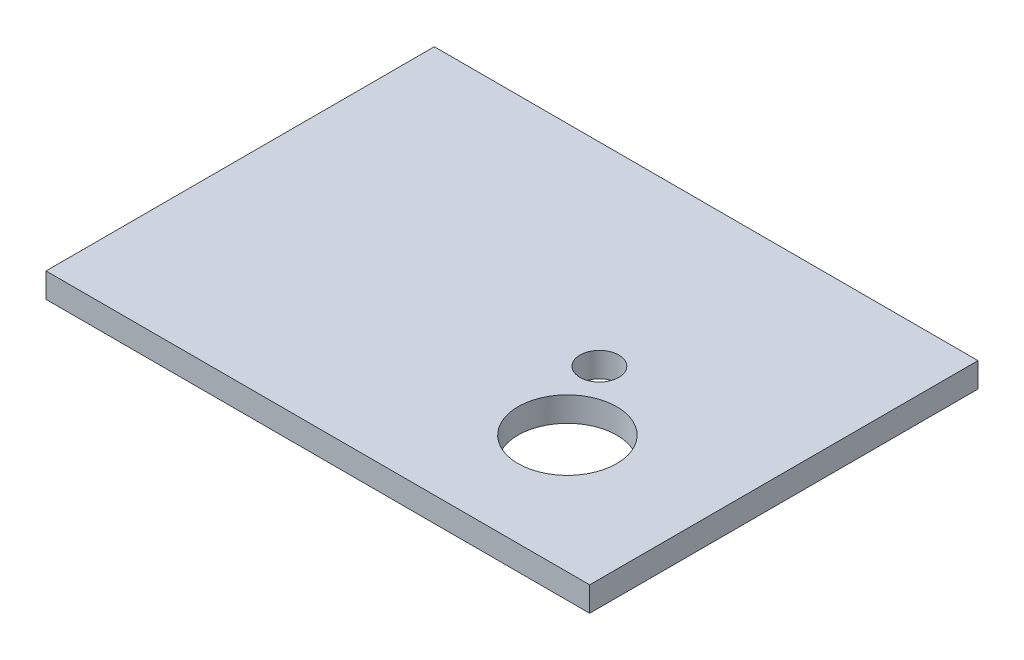
ISO-10303-21;
HEADER;
FILE_DESCRIPTION(('STEP AP214'),'2;1');
FILE_NAME('part.step','',(''),(''),'','','');
FILE_SCHEMA(('AUTOMOTIVE_DESIGN { 1 0 10303 214 1 1 1 1 }'));
ENDSEC;
DATA;
#1=APPLICATION_CONTEXT('core data for automotive mechanical design processes');
#2=APPLICATION_PROTOCOL_DEFINITION('international standard','automotive_design',2000,#1);
#3=PRODUCT_CONTEXT('',#1,'mechanical');
#4=PRODUCT('Part','Part','',(#3));
#5=PRODUCT_RELATED_PRODUCT_CATEGORY('part','',(#4));
#6=PRODUCT_DEFINITION_FORMATION('','',#4);
#7=PRODUCT_DEFINITION_CONTEXT('part definition',#1,'design');
#8=PRODUCT_DEFINITION('design','',#6,#7);
#9=PRODUCT_DEFINITION_SHAPE('','',#8);
#10=(LENGTH_UNIT() NAMED_UNIT(*) SI_UNIT(.MILLI.,.METRE.));
#11=(NAMED_UNIT(*) PLANE_ANGLE_UNIT() SI_UNIT($,.RADIAN.));
#12=(NAMED_UNIT(*) SI_UNIT($,.STERADIAN.) SOLID_ANGLE_UNIT());
#13=UNCERTAINTY_MEASURE_WITH_UNIT(LENGTH_MEASURE(1.E-05),#10,'distance_accuracy_value','');
#14=(GEOMETRIC_REPRESENTATION_CONTEXT(3) GLOBAL_UNCERTAINTY_ASSIGNED_CONTEXT((#13)) GLOBAL_UNIT_ASSIGNED_CONTEXT((#10,
#11,#12)) REPRESENTATION_CONTEXT('',''));
#15=CARTESIAN_POINT('',(0.,0.,0.));
#16=DIRECTION('',(0.,0.,1.));
#17=DIRECTION('',(1.,0.,0.));
#18=AXIS2_PLACEMENT_3D('',#15,#16,#17);
#19=CARTESIAN_POINT('',(0.,6.35,0.));
#20=DIRECTION('',(1.,0.,0.));
#21=DIRECTION('',(0.,0.,-1.));
#22=AXIS2_PLACEMENT_3D('',#19,#20,#21);
#23=PLANE('',#22);
#24=DIRECTION('',(0.,0.,1.));
#25=VECTOR('',#24,1.);
#26=CARTESIAN_POINT('',(0.,0.,0.));
#27=LINE('',#26,#25);
#28=CARTESIAN_POINT('',(0.,0.,-100.));
#29=VERTEX_POINT('',#28);
#30=CARTESIAN_POINT('',(0.,0.,0.));
#31=VERTEX_POINT('',#30);
#32=EDGE_CURVE('E99',#29,#31,#27,.T.);
#33=ORIENTED_EDGE('',*,*,#32,.T.);
#34=DIRECTION('',(0.,-1.,0.));
#35=VECTOR('',#34,1.);
#36=CARTESIAN_POINT('',(0.,6.35,0.));
#37=LINE('',#36,#35);
#38=CARTESIAN_POINT('',(0.,6.35,0.));
#39=VERTEX_POINT('',#38);
#40=EDGE_CURVE('E11',#39,#31,#37,.T.);
#41=ORIENTED_EDGE('',*,*,#40,.F.);
#42=DIRECTION('',(0.,0.,1.));
#43=VECTOR('',#42,1.);
#44=CARTESIAN_POINT('',(0.,6.35,0.));
#45=LINE('',#44,#43);
#46=CARTESIAN_POINT('',(0.,6.35,-100.));
#47=VERTEX_POINT('',#46);
#48=EDGE_CURVE('E86',#47,#39,#45,.T.);
#49=ORIENTED_EDGE('',*,*,#48,.F.);
#50=DIRECTION('',(0.,-1.,0.));
#51=VECTOR('',#50,1.);
#52=CARTESIAN_POINT('',(0.,6.35,-100.));
#53=LINE('',#52,#51);
#54=EDGE_CURVE('E95',#47,#29,#53,.T.);
#55=ORIENTED_EDGE('',*,*,#54,.T.);
#56=EDGE_LOOP('',(#33,#41,#49,#55));
#57=FACE_BOUND('',#56,.T.);
#58=ADVANCED_FACE('F33',(#57),#23,.F.);
#59=CARTESIAN_POINT('',(0.,6.35,0.));
#60=DIRECTION('',(0.,0.,-1.));
#61=DIRECTION('',(-1.,0.,0.));
#62=AXIS2_PLACEMENT_3D('',#59,#60,#61);
#63=PLANE('',#62);
#64=DIRECTION('',(1.,0.,0.));
#65=VECTOR('',#64,1.);
#66=CARTESIAN_POINT('',(0.,0.,0.));
#67=LINE('',#66,#65);
#68=CARTESIAN_POINT('',(140.,0.,0.));
#69=VERTEX_POINT('',#68);
#70=EDGE_CURVE('E90',#31,#69,#67,.T.);
#71=ORIENTED_EDGE('',*,*,#70,.T.);
#72=DIRECTION('',(0.,-1.,0.));
#73=VECTOR('',#72,1.);
#74=CARTESIAN_POINT('',(140.,6.35,0.));
#75=LINE('',#74,#73);
#76=CARTESIAN_POINT('',(140.,6.35,0.));
#77=VERTEX_POINT('',#76);
#78=EDGE_CURVE('E42',#77,#69,#75,.T.);
#79=ORIENTED_EDGE('',*,*,#78,.F.);
#80=DIRECTION('',(1.,0.,0.));
#81=VECTOR('',#80,1.);
#82=CARTESIAN_POINT('',(0.,6.35,0.));
#83=LINE('',#82,#81);
#84=EDGE_CURVE('E81',#39,#77,#83,.T.);
#85=ORIENTED_EDGE('',*,*,#84,.F.);
#86=ORIENTED_EDGE('',*,*,#40,.T.);
#87=EDGE_LOOP('',(#71,#79,#85,#86));
#88=FACE_BOUND('',#87,.T.);
#89=ADVANCED_FACE('F89',(#88),#63,.F.);
#90=CARTESIAN_POINT('',(140.,6.35,0.));
#91=DIRECTION('',(-1.,0.,0.));
#92=DIRECTION('',(0.,0.,1.));
#93=AXIS2_PLACEMENT_3D('',#90,#91,#92);
#94=PLANE('',#93);
#95=DIRECTION('',(0.,0.,-1.));
#96=VECTOR('',#95,1.);
#97=CARTESIAN_POINT('',(140.,0.,0.));
#98=LINE('',#97,#96);
#99=CARTESIAN_POINT('',(140.,0.,-100.));
#100=VERTEX_POINT('',#99);
#101=EDGE_CURVE('E68',#69,#100,#98,.T.);
#102=ORIENTED_EDGE('',*,*,#101,.T.);
#103=DIRECTION('',(0.,-1.,0.));
#104=VECTOR('',#103,1.);
#105=CARTESIAN_POINT('',(140.,6.35,-100.));
#106=LINE('',#105,#104);
#107=CARTESIAN_POINT('',(140.,6.35,-100.));
#108=VERTEX_POINT('',#107);
#109=EDGE_CURVE('E91',#108,#100,#106,.T.);
#110=ORIENTED_EDGE('',*,*,#109,.F.);
#111=DIRECTION('',(0.,0.,-1.));
#112=VECTOR('',#111,1.);
#113=CARTESIAN_POINT('',(140.,6.35,0.));
#114=LINE('',#113,#112);
#115=EDGE_CURVE('E84',#77,#108,#114,.T.);
#116=ORIENTED_EDGE('',*,*,#115,.F.);
#117=ORIENTED_EDGE('',*,*,#78,.T.);
#118=EDGE_LOOP('',(#102,#110,#116,#117));
#119=FACE_BOUND('',#118,.T.);
#120=ADVANCED_FACE('F93',(#119),#94,.F.);
#121=CARTESIAN_POINT('',(0.,6.35,-100.));
#122=DIRECTION('',(0.,0.,1.));
#123=DIRECTION('',(1.,0.,0.));
#124=AXIS2_PLACEMENT_3D('',#121,#122,#123);
#125=PLANE('',#124);
#126=DIRECTION('',(-1.,0.,0.));
#127=VECTOR('',#126,1.);
#128=CARTESIAN_POINT('',(0.,0.,-100.));
#129=LINE('',#128,#127);
#130=EDGE_CURVE('E74',#100,#29,#129,.T.);
#131=ORIENTED_EDGE('',*,*,#130,.T.);
#132=ORIENTED_EDGE('',*,*,#54,.F.);
#133=DIRECTION('',(-1.,0.,0.));
#134=VECTOR('',#133,1.);
#135=CARTESIAN_POINT('',(0.,6.35,-100.));
#136=LINE('',#135,#134);
#137=EDGE_CURVE('E51',#108,#47,#136,.T.);
#138=ORIENTED_EDGE('',*,*,#137,.F.);
#139=ORIENTED_EDGE('',*,*,#109,.T.);
#140=EDGE_LOOP('',(#131,#132,#138,#139));
#141=FACE_BOUND('',#140,.T.);
#142=ADVANCED_FACE('F125',(#141),#125,.F.);
#143=CARTESIAN_POINT('',(0.,6.35,0.));
#144=DIRECTION('',(0.,-1.,0.));
#145=DIRECTION('',(0.,0.,-1.));
#146=AXIS2_PLACEMENT_3D('',#143,#144,#145);
#147=PLANE('',#146);
#148=CARTESIAN_POINT('',(103.75,6.35,-30.5144284148501));
#149=DIRECTION('',(0.,1.,0.));
#150=DIRECTION('',(0.,0.,1.));
#151=AXIS2_PLACEMENT_3D('',#148,#149,#150);
#152=CIRCLE('',#151,12.705);
#153=CARTESIAN_POINT('',(103.75,6.35,-17.8094284148501));
#154=VERTEX_POINT('',#153);
#155=EDGE_CURVE('E108',#154,#154,#152,.T.);
#156=ORIENTED_EDGE('',*,*,#155,.F.);
#157=EDGE_LOOP('',(#156));
#158=FACE_BOUND('',#157,.T.);
#159=CARTESIAN_POINT('',(92.5,6.35,-50.));
#160=DIRECTION('',(0.,1.,0.));
#161=DIRECTION('',(0.,0.,1.));
#162=AXIS2_PLACEMENT_3D('',#159,#160,#161);
#163=CIRCLE('',#162,5.00000000000001);
#164=CARTESIAN_POINT('',(92.5,6.35,-45.));
#165=VERTEX_POINT('',#164);
#166=EDGE_CURVE('E113',#165,#165,#163,.T.);
#167=ORIENTED_EDGE('',*,*,#166,.F.);
#168=EDGE_LOOP('',(#167));
#169=FACE_BOUND('',#168,.T.);
#170=ORIENTED_EDGE('',*,*,#48,.T.);
#171=ORIENTED_EDGE('',*,*,#84,.T.);
#172=ORIENTED_EDGE('',*,*,#115,.T.);
#173=ORIENTED_EDGE('',*,*,#137,.T.);
#174=EDGE_LOOP('',(#170,#171,#172,#173));
#175=FACE_BOUND('',#174,.T.);
#176=ADVANCED_FACE('F82',(#158,#169,#175),#147,.F.);
#177=CARTESIAN_POINT('',(0.,0.,0.));
#178=DIRECTION('',(0.,-1.,0.));
#179=DIRECTION('',(0.,0.,-1.));
#180=AXIS2_PLACEMENT_3D('',#177,#178,#179);
#181=PLANE('',#180);
#182=CARTESIAN_POINT('',(103.75,0.,-30.5144284148501));
#183=DIRECTION('',(0.,-1.,0.));
#184=DIRECTION('',(0.,0.,-1.));
#185=AXIS2_PLACEMENT_3D('',#182,#183,#184);
#186=CIRCLE('',#185,12.705);
#187=CARTESIAN_POINT('',(103.75,0.,-43.2194284148501));
#188=VERTEX_POINT('',#187);
#189=EDGE_CURVE('E36',#188,#188,#186,.T.);
#190=ORIENTED_EDGE('',*,*,#189,.F.);
#191=EDGE_LOOP('',(#190));
#192=FACE_BOUND('',#191,.T.);
#193=CARTESIAN_POINT('',(92.5,0.,-50.));
#194=DIRECTION('',(0.,-1.,0.));
#195=DIRECTION('',(0.,0.,-1.));
#196=AXIS2_PLACEMENT_3D('',#193,#194,#195);
#197=CIRCLE('',#196,5.00000000000001);
#198=CARTESIAN_POINT('',(92.5,0.,-55.));
#199=VERTEX_POINT('',#198);
#200=EDGE_CURVE('E106',#199,#199,#197,.T.);
#201=ORIENTED_EDGE('',*,*,#200,.F.);
#202=EDGE_LOOP('',(#201));
#203=FACE_BOUND('',#202,.T.);
#204=ORIENTED_EDGE('',*,*,#32,.F.);
#205=ORIENTED_EDGE('',*,*,#130,.F.);
#206=ORIENTED_EDGE('',*,*,#101,.F.);
#207=ORIENTED_EDGE('',*,*,#70,.F.);
#208=EDGE_LOOP('',(#204,#205,#206,#207));
#209=FACE_BOUND('',#208,.T.);
#210=ADVANCED_FACE('F124',(#192,#203,#209),#181,.T.);
#211=CARTESIAN_POINT('',(92.5,-3.65,-50.));
#212=DIRECTION('',(0.,1.,0.));
#213=DIRECTION('',(0.,0.,1.));
#214=AXIS2_PLACEMENT_3D('',#211,#212,#213);
#215=CYLINDRICAL_SURFACE('',#214,5.00000000000001);
#216=ORIENTED_EDGE('',*,*,#200,.T.);
#217=EDGE_LOOP('',(#216));
#218=FACE_BOUND('',#217,.T.);
#219=ORIENTED_EDGE('',*,*,#166,.T.);
#220=EDGE_LOOP('',(#219));
#221=FACE_BOUND('',#220,.T.);
#222=ADVANCED_FACE('F121',(#218,#221),#215,.F.);
#223=CARTESIAN_POINT('',(103.75,-3.65,-30.5144284148501));
#224=DIRECTION('',(0.,1.,0.));
#225=DIRECTION('',(0.,0.,1.));
#226=AXIS2_PLACEMENT_3D('',#223,#224,#225);
#227=CYLINDRICAL_SURFACE('',#226,12.705);
#228=ORIENTED_EDGE('',*,*,#189,.T.);
#229=EDGE_LOOP('',(#228));
#230=FACE_BOUND('',#229,.T.);
#231=ORIENTED_EDGE('',*,*,#155,.T.);
#232=EDGE_LOOP('',(#231));
#233=FACE_BOUND('',#232,.T.);
#234=ADVANCED_FACE('F172',(#230,#233),#227,.F.);
#235=CLOSED_SHELL('',(#58,#89,#120,#142,#176,#210,#222,#234));
#236=MANIFOLD_SOLID_BREP('B2',#235);
#237=ADVANCED_BREP_SHAPE_REPRESENTATION('',(#18,#236),#14);
#238=SHAPE_DEFINITION_REPRESENTATION(#9,#237);
ENDSEC;
END-ISO-10303-21;
